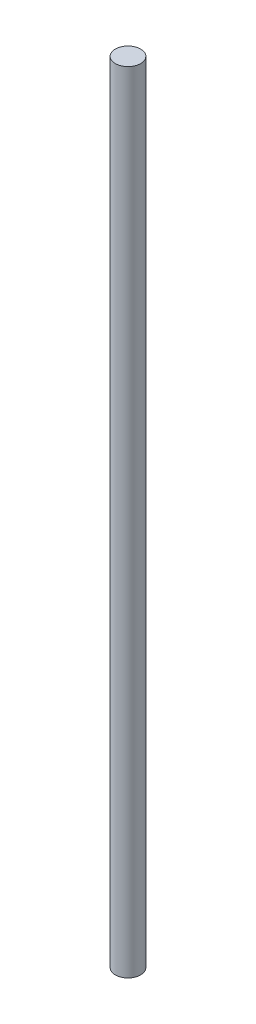
ISO-10303-21;
HEADER;
FILE_DESCRIPTION(('STEP AP214'),'2;1');
FILE_NAME('part.step','',(''),(''),'','','');
FILE_SCHEMA(('AUTOMOTIVE_DESIGN { 1 0 10303 214 1 1 1 1 }'));
ENDSEC;
DATA;
#1=APPLICATION_CONTEXT('core data for automotive mechanical design processes');
#2=APPLICATION_PROTOCOL_DEFINITION('international standard','automotive_design',2000,#1);
#3=PRODUCT_CONTEXT('',#1,'mechanical');
#4=PRODUCT('Part','Part','',(#3));
#5=PRODUCT_RELATED_PRODUCT_CATEGORY('part','',(#4));
#6=PRODUCT_DEFINITION_FORMATION('','',#4);
#7=PRODUCT_DEFINITION_CONTEXT('part definition',#1,'design');
#8=PRODUCT_DEFINITION('design','',#6,#7);
#9=PRODUCT_DEFINITION_SHAPE('','',#8);
#10=(LENGTH_UNIT() NAMED_UNIT(*) SI_UNIT(.MILLI.,.METRE.));
#11=(NAMED_UNIT(*) PLANE_ANGLE_UNIT() SI_UNIT($,.RADIAN.));
#12=(NAMED_UNIT(*) SI_UNIT($,.STERADIAN.) SOLID_ANGLE_UNIT());
#13=UNCERTAINTY_MEASURE_WITH_UNIT(LENGTH_MEASURE(1.E-05),#10,'distance_accuracy_value','');
#14=(GEOMETRIC_REPRESENTATION_CONTEXT(3) GLOBAL_UNCERTAINTY_ASSIGNED_CONTEXT((#13)) GLOBAL_UNIT_ASSIGNED_CONTEXT((#10,
#11,#12)) REPRESENTATION_CONTEXT('',''));
#15=CARTESIAN_POINT('',(0.,0.,0.));
#16=DIRECTION('',(0.,0.,1.));
#17=DIRECTION('',(1.,0.,0.));
#18=AXIS2_PLACEMENT_3D('',#15,#16,#17);
#19=CARTESIAN_POINT('',(0.,250.,0.));
#20=DIRECTION('',(0.,-1.,0.));
#21=DIRECTION('',(0.,0.,-1.));
#22=AXIS2_PLACEMENT_3D('',#19,#20,#21);
#23=CYLINDRICAL_SURFACE('',#22,4.);
#24=CARTESIAN_POINT('',(0.,250.,0.));
#25=DIRECTION('',(0.,1.,0.));
#26=DIRECTION('',(0.,0.,1.));
#27=AXIS2_PLACEMENT_3D('',#24,#25,#26);
#28=CIRCLE('',#27,4.);
#29=CARTESIAN_POINT('',(0.,250.,4.));
#30=VERTEX_POINT('',#29);
#31=EDGE_CURVE('E10',#30,#30,#28,.T.);
#32=ORIENTED_EDGE('',*,*,#31,.F.);
#33=EDGE_LOOP('',(#32));
#34=FACE_BOUND('',#33,.T.);
#35=CARTESIAN_POINT('',(0.,0.,0.));
#36=DIRECTION('',(0.,1.,0.));
#37=DIRECTION('',(0.,0.,1.));
#38=AXIS2_PLACEMENT_3D('',#35,#36,#37);
#39=CIRCLE('',#38,4.);
#40=CARTESIAN_POINT('',(0.,0.,4.));
#41=VERTEX_POINT('',#40);
#42=EDGE_CURVE('E40',#41,#41,#39,.T.);
#43=ORIENTED_EDGE('',*,*,#42,.T.);
#44=EDGE_LOOP('',(#43));
#45=FACE_BOUND('',#44,.T.);
#46=ADVANCED_FACE('F37',(#34,#45),#23,.T.);
#47=CARTESIAN_POINT('',(0.,250.,0.));
#48=DIRECTION('',(0.,1.,0.));
#49=DIRECTION('',(0.,0.,1.));
#50=AXIS2_PLACEMENT_3D('',#47,#48,#49);
#51=PLANE('',#50);
#52=ORIENTED_EDGE('',*,*,#31,.T.);
#53=EDGE_LOOP('',(#52));
#54=FACE_BOUND('',#53,.T.);
#55=ADVANCED_FACE('F54',(#54),#51,.T.);
#56=CARTESIAN_POINT('',(0.,0.,0.));
#57=DIRECTION('',(0.,1.,0.));
#58=DIRECTION('',(0.,0.,1.));
#59=AXIS2_PLACEMENT_3D('',#56,#57,#58);
#60=PLANE('',#59);
#61=ORIENTED_EDGE('',*,*,#42,.F.);
#62=EDGE_LOOP('',(#61));
#63=FACE_BOUND('',#62,.T.);
#64=ADVANCED_FACE('F52',(#63),#60,.F.);
#65=CLOSED_SHELL('',(#46,#55,#64));
#66=MANIFOLD_SOLID_BREP('B2',#65);
#67=ADVANCED_BREP_SHAPE_REPRESENTATION('',(#18,#66),#14);
#68=SHAPE_DEFINITION_REPRESENTATION(#9,#67);
ENDSEC;
END-ISO-10303-21;
